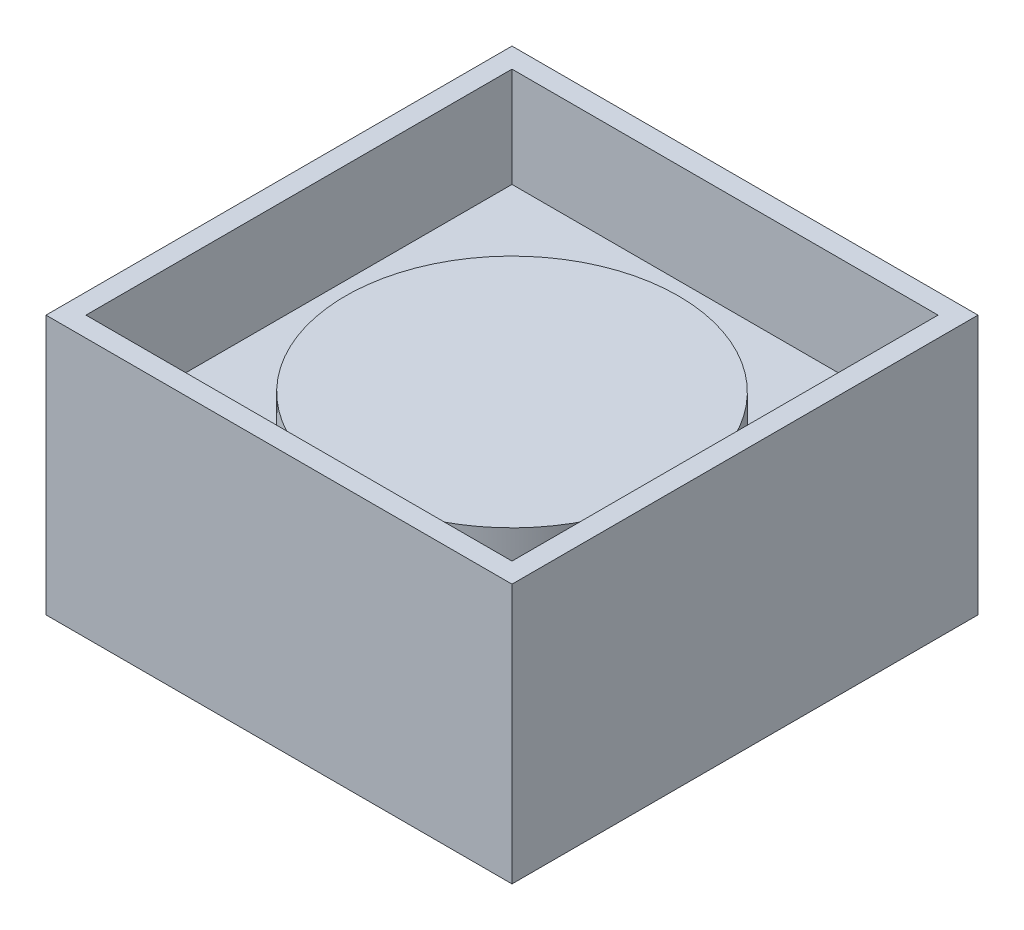
ISO-10303-21;
HEADER;
FILE_DESCRIPTION(('STEP AP214'),'2;1');
FILE_NAME('part.step','',(''),(''),'','','');
FILE_SCHEMA(('AUTOMOTIVE_DESIGN { 1 0 10303 214 1 1 1 1 }'));
ENDSEC;
DATA;
#1=APPLICATION_CONTEXT('core data for automotive mechanical design processes');
#2=APPLICATION_PROTOCOL_DEFINITION('international standard','automotive_design',2000,#1);
#3=PRODUCT_CONTEXT('',#1,'mechanical');
#4=PRODUCT('Part','Part','',(#3));
#5=PRODUCT_RELATED_PRODUCT_CATEGORY('part','',(#4));
#6=PRODUCT_DEFINITION_FORMATION('','',#4);
#7=PRODUCT_DEFINITION_CONTEXT('part definition',#1,'design');
#8=PRODUCT_DEFINITION('design','',#6,#7);
#9=PRODUCT_DEFINITION_SHAPE('','',#8);
#10=(LENGTH_UNIT() NAMED_UNIT(*) SI_UNIT(.MILLI.,.METRE.));
#11=(NAMED_UNIT(*) PLANE_ANGLE_UNIT() SI_UNIT($,.RADIAN.));
#12=(NAMED_UNIT(*) SI_UNIT($,.STERADIAN.) SOLID_ANGLE_UNIT());
#13=UNCERTAINTY_MEASURE_WITH_UNIT(LENGTH_MEASURE(1.E-05),#10,'distance_accuracy_value','');
#14=(GEOMETRIC_REPRESENTATION_CONTEXT(3) GLOBAL_UNCERTAINTY_ASSIGNED_CONTEXT((#13)) GLOBAL_UNIT_ASSIGNED_CONTEXT((#10,
#11,#12)) REPRESENTATION_CONTEXT('',''));
#15=CARTESIAN_POINT('',(0.,0.,0.));
#16=DIRECTION('',(0.,0.,1.));
#17=DIRECTION('',(1.,0.,0.));
#18=AXIS2_PLACEMENT_3D('',#15,#16,#17);
#19=CARTESIAN_POINT('',(-35.,39.,-35.));
#20=DIRECTION('',(1.,0.,0.));
#21=DIRECTION('',(0.,0.,-1.));
#22=AXIS2_PLACEMENT_3D('',#19,#20,#21);
#23=PLANE('',#22);
#24=DIRECTION('',(0.,0.,1.));
#25=VECTOR('',#24,1.);
#26=CARTESIAN_POINT('',(-35.,0.,-35.));
#27=LINE('',#26,#25);
#28=CARTESIAN_POINT('',(-35.,0.,-35.));
#29=VERTEX_POINT('',#28);
#30=CARTESIAN_POINT('',(-35.,0.,35.));
#31=VERTEX_POINT('',#30);
#32=EDGE_CURVE('E144',#29,#31,#27,.T.);
#33=ORIENTED_EDGE('',*,*,#32,.T.);
#34=DIRECTION('',(0.,-1.,0.));
#35=VECTOR('',#34,1.);
#36=CARTESIAN_POINT('',(-35.,39.,35.));
#37=LINE('',#36,#35);
#38=CARTESIAN_POINT('',(-35.,39.,35.));
#39=VERTEX_POINT('',#38);
#40=EDGE_CURVE('E40',#39,#31,#37,.T.);
#41=ORIENTED_EDGE('',*,*,#40,.F.);
#42=DIRECTION('',(0.,0.,1.));
#43=VECTOR('',#42,1.);
#44=CARTESIAN_POINT('',(-35.,39.,-35.));
#45=LINE('',#44,#43);
#46=CARTESIAN_POINT('',(-35.,39.,-35.));
#47=VERTEX_POINT('',#46);
#48=EDGE_CURVE('E148',#47,#39,#45,.T.);
#49=ORIENTED_EDGE('',*,*,#48,.F.);
#50=DIRECTION('',(0.,-1.,0.));
#51=VECTOR('',#50,1.);
#52=CARTESIAN_POINT('',(-35.,39.,-35.));
#53=LINE('',#52,#51);
#54=EDGE_CURVE('E154',#47,#29,#53,.T.);
#55=ORIENTED_EDGE('',*,*,#54,.T.);
#56=EDGE_LOOP('',(#33,#41,#49,#55));
#57=FACE_BOUND('',#56,.T.);
#58=ADVANCED_FACE('F33',(#57),#23,.F.);
#59=CARTESIAN_POINT('',(35.,39.,35.));
#60=DIRECTION('',(0.,0.,-1.));
#61=DIRECTION('',(-1.,0.,0.));
#62=AXIS2_PLACEMENT_3D('',#59,#60,#61);
#63=PLANE('',#62);
#64=DIRECTION('',(1.,0.,0.));
#65=VECTOR('',#64,1.);
#66=CARTESIAN_POINT('',(35.,0.,35.));
#67=LINE('',#66,#65);
#68=CARTESIAN_POINT('',(35.,0.,35.));
#69=VERTEX_POINT('',#68);
#70=EDGE_CURVE('E157',#31,#69,#67,.T.);
#71=ORIENTED_EDGE('',*,*,#70,.T.);
#72=DIRECTION('',(0.,-1.,0.));
#73=VECTOR('',#72,1.);
#74=CARTESIAN_POINT('',(35.,39.,35.));
#75=LINE('',#74,#73);
#76=CARTESIAN_POINT('',(35.,39.,35.));
#77=VERTEX_POINT('',#76);
#78=EDGE_CURVE('E165',#77,#69,#75,.T.);
#79=ORIENTED_EDGE('',*,*,#78,.F.);
#80=DIRECTION('',(1.,0.,0.));
#81=VECTOR('',#80,1.);
#82=CARTESIAN_POINT('',(35.,39.,35.));
#83=LINE('',#82,#81);
#84=EDGE_CURVE('E85',#39,#77,#83,.T.);
#85=ORIENTED_EDGE('',*,*,#84,.F.);
#86=ORIENTED_EDGE('',*,*,#40,.T.);
#87=EDGE_LOOP('',(#71,#79,#85,#86));
#88=FACE_BOUND('',#87,.T.);
#89=ADVANCED_FACE('F168',(#88),#63,.F.);
#90=CARTESIAN_POINT('',(35.,39.,-35.));
#91=DIRECTION('',(-1.,0.,0.));
#92=DIRECTION('',(0.,0.,1.));
#93=AXIS2_PLACEMENT_3D('',#90,#91,#92);
#94=PLANE('',#93);
#95=DIRECTION('',(0.,0.,-1.));
#96=VECTOR('',#95,1.);
#97=CARTESIAN_POINT('',(35.,0.,-35.));
#98=LINE('',#97,#96);
#99=CARTESIAN_POINT('',(35.,0.,-35.));
#100=VERTEX_POINT('',#99);
#101=EDGE_CURVE('E159',#69,#100,#98,.T.);
#102=ORIENTED_EDGE('',*,*,#101,.T.);
#103=DIRECTION('',(0.,-1.,0.));
#104=VECTOR('',#103,1.);
#105=CARTESIAN_POINT('',(35.,39.,-35.));
#106=LINE('',#105,#104);
#107=CARTESIAN_POINT('',(35.,39.,-35.));
#108=VERTEX_POINT('',#107);
#109=EDGE_CURVE('E163',#108,#100,#106,.T.);
#110=ORIENTED_EDGE('',*,*,#109,.F.);
#111=DIRECTION('',(0.,0.,-1.));
#112=VECTOR('',#111,1.);
#113=CARTESIAN_POINT('',(35.,39.,-35.));
#114=LINE('',#113,#112);
#115=EDGE_CURVE('E151',#77,#108,#114,.T.);
#116=ORIENTED_EDGE('',*,*,#115,.F.);
#117=ORIENTED_EDGE('',*,*,#78,.T.);
#118=EDGE_LOOP('',(#102,#110,#116,#117));
#119=FACE_BOUND('',#118,.T.);
#120=ADVANCED_FACE('F177',(#119),#94,.F.);
#121=CARTESIAN_POINT('',(35.,39.,-35.));
#122=DIRECTION('',(0.,0.,1.));
#123=DIRECTION('',(1.,0.,0.));
#124=AXIS2_PLACEMENT_3D('',#121,#122,#123);
#125=PLANE('',#124);
#126=DIRECTION('',(-1.,0.,0.));
#127=VECTOR('',#126,1.);
#128=CARTESIAN_POINT('',(35.,0.,-35.));
#129=LINE('',#128,#127);
#130=EDGE_CURVE('E77',#100,#29,#129,.T.);
#131=ORIENTED_EDGE('',*,*,#130,.T.);
#132=ORIENTED_EDGE('',*,*,#54,.F.);
#133=DIRECTION('',(-1.,0.,0.));
#134=VECTOR('',#133,1.);
#135=CARTESIAN_POINT('',(35.,39.,-35.));
#136=LINE('',#135,#134);
#137=EDGE_CURVE('E56',#108,#47,#136,.T.);
#138=ORIENTED_EDGE('',*,*,#137,.F.);
#139=ORIENTED_EDGE('',*,*,#109,.T.);
#140=EDGE_LOOP('',(#131,#132,#138,#139));
#141=FACE_BOUND('',#140,.T.);
#142=ADVANCED_FACE('F179',(#141),#125,.F.);
#143=CARTESIAN_POINT('',(0.,39.,0.));
#144=DIRECTION('',(0.,-1.,0.));
#145=DIRECTION('',(0.,0.,-1.));
#146=AXIS2_PLACEMENT_3D('',#143,#144,#145);
#147=PLANE('',#146);
#148=DIRECTION('',(1.,0.,0.));
#149=VECTOR('',#148,1.);
#150=CARTESIAN_POINT('',(32.,39.,32.));
#151=LINE('',#150,#149);
#152=CARTESIAN_POINT('',(-32.,39.,32.));
#153=VERTEX_POINT('',#152);
#154=CARTESIAN_POINT('',(32.,39.,32.));
#155=VERTEX_POINT('',#154);
#156=EDGE_CURVE('E138',#153,#155,#151,.T.);
#157=ORIENTED_EDGE('',*,*,#156,.F.);
#158=DIRECTION('',(0.,0.,1.));
#159=VECTOR('',#158,1.);
#160=CARTESIAN_POINT('',(-32.,39.,-32.));
#161=LINE('',#160,#159);
#162=CARTESIAN_POINT('',(-32.,39.,-32.));
#163=VERTEX_POINT('',#162);
#164=EDGE_CURVE('E47',#163,#153,#161,.T.);
#165=ORIENTED_EDGE('',*,*,#164,.F.);
#166=DIRECTION('',(-1.,0.,0.));
#167=VECTOR('',#166,1.);
#168=CARTESIAN_POINT('',(32.,39.,-32.));
#169=LINE('',#168,#167);
#170=CARTESIAN_POINT('',(32.,39.,-32.));
#171=VERTEX_POINT('',#170);
#172=EDGE_CURVE('E127',#171,#163,#169,.T.);
#173=ORIENTED_EDGE('',*,*,#172,.F.);
#174=DIRECTION('',(0.,0.,-1.));
#175=VECTOR('',#174,1.);
#176=CARTESIAN_POINT('',(32.,39.,-32.));
#177=LINE('',#176,#175);
#178=EDGE_CURVE('E130',#155,#171,#177,.T.);
#179=ORIENTED_EDGE('',*,*,#178,.F.);
#180=EDGE_LOOP('',(#157,#165,#173,#179));
#181=FACE_BOUND('',#180,.T.);
#182=ORIENTED_EDGE('',*,*,#48,.T.);
#183=ORIENTED_EDGE('',*,*,#84,.T.);
#184=ORIENTED_EDGE('',*,*,#115,.T.);
#185=ORIENTED_EDGE('',*,*,#137,.T.);
#186=EDGE_LOOP('',(#182,#183,#184,#185));
#187=FACE_BOUND('',#186,.T.);
#188=ADVANCED_FACE('F180',(#181,#187),#147,.F.);
#189=CARTESIAN_POINT('',(0.,0.,0.));
#190=DIRECTION('',(0.,-1.,0.));
#191=DIRECTION('',(0.,0.,-1.));
#192=AXIS2_PLACEMENT_3D('',#189,#190,#191);
#193=PLANE('',#192);
#194=ORIENTED_EDGE('',*,*,#32,.F.);
#195=ORIENTED_EDGE('',*,*,#130,.F.);
#196=ORIENTED_EDGE('',*,*,#101,.F.);
#197=ORIENTED_EDGE('',*,*,#70,.F.);
#198=EDGE_LOOP('',(#194,#195,#196,#197));
#199=FACE_BOUND('',#198,.T.);
#200=ADVANCED_FACE('F173',(#199),#193,.T.);
#201=CARTESIAN_POINT('',(-32.,24.,-32.));
#202=DIRECTION('',(-1.,0.,0.));
#203=DIRECTION('',(0.,0.,1.));
#204=AXIS2_PLACEMENT_3D('',#201,#202,#203);
#205=PLANE('',#204);
#206=ORIENTED_EDGE('',*,*,#164,.T.);
#207=DIRECTION('',(0.,1.,0.));
#208=VECTOR('',#207,1.);
#209=CARTESIAN_POINT('',(-32.,24.,32.));
#210=LINE('',#209,#208);
#211=CARTESIAN_POINT('',(-32.,24.,32.));
#212=VERTEX_POINT('',#211);
#213=EDGE_CURVE('E105',#212,#153,#210,.T.);
#214=ORIENTED_EDGE('',*,*,#213,.F.);
#215=DIRECTION('',(0.,0.,1.));
#216=VECTOR('',#215,1.);
#217=CARTESIAN_POINT('',(-32.,24.,-32.));
#218=LINE('',#217,#216);
#219=CARTESIAN_POINT('',(-32.,24.,-32.));
#220=VERTEX_POINT('',#219);
#221=EDGE_CURVE('E109',#220,#212,#218,.T.);
#222=ORIENTED_EDGE('',*,*,#221,.F.);
#223=DIRECTION('',(0.,1.,0.));
#224=VECTOR('',#223,1.);
#225=CARTESIAN_POINT('',(-32.,24.,-32.));
#226=LINE('',#225,#224);
#227=EDGE_CURVE('E142',#220,#163,#226,.T.);
#228=ORIENTED_EDGE('',*,*,#227,.T.);
#229=EDGE_LOOP('',(#206,#214,#222,#228));
#230=FACE_BOUND('',#229,.T.);
#231=ADVANCED_FACE('F107',(#230),#205,.F.);
#232=CARTESIAN_POINT('',(32.,24.,-32.));
#233=DIRECTION('',(0.,0.,-1.));
#234=DIRECTION('',(-1.,0.,0.));
#235=AXIS2_PLACEMENT_3D('',#232,#233,#234);
#236=PLANE('',#235);
#237=ORIENTED_EDGE('',*,*,#172,.T.);
#238=ORIENTED_EDGE('',*,*,#227,.F.);
#239=DIRECTION('',(-1.,0.,0.));
#240=VECTOR('',#239,1.);
#241=CARTESIAN_POINT('',(32.,24.,-32.));
#242=LINE('',#241,#240);
#243=CARTESIAN_POINT('',(32.,24.,-32.));
#244=VERTEX_POINT('',#243);
#245=EDGE_CURVE('E115',#244,#220,#242,.T.);
#246=ORIENTED_EDGE('',*,*,#245,.F.);
#247=DIRECTION('',(0.,1.,0.));
#248=VECTOR('',#247,1.);
#249=CARTESIAN_POINT('',(32.,24.,-32.));
#250=LINE('',#249,#248);
#251=EDGE_CURVE('E145',#244,#171,#250,.T.);
#252=ORIENTED_EDGE('',*,*,#251,.T.);
#253=EDGE_LOOP('',(#237,#238,#246,#252));
#254=FACE_BOUND('',#253,.T.);
#255=ADVANCED_FACE('F224',(#254),#236,.F.);
#256=CARTESIAN_POINT('',(32.,24.,-32.));
#257=DIRECTION('',(1.,0.,0.));
#258=DIRECTION('',(0.,0.,-1.));
#259=AXIS2_PLACEMENT_3D('',#256,#257,#258);
#260=PLANE('',#259);
#261=ORIENTED_EDGE('',*,*,#178,.T.);
#262=ORIENTED_EDGE('',*,*,#251,.F.);
#263=DIRECTION('',(0.,0.,-1.));
#264=VECTOR('',#263,1.);
#265=CARTESIAN_POINT('',(32.,24.,-32.));
#266=LINE('',#265,#264);
#267=CARTESIAN_POINT('',(32.,24.,32.));
#268=VERTEX_POINT('',#267);
#269=EDGE_CURVE('E123',#268,#244,#266,.T.);
#270=ORIENTED_EDGE('',*,*,#269,.F.);
#271=DIRECTION('',(0.,1.,0.));
#272=VECTOR('',#271,1.);
#273=CARTESIAN_POINT('',(32.,24.,32.));
#274=LINE('',#273,#272);
#275=EDGE_CURVE('E114',#268,#155,#274,.T.);
#276=ORIENTED_EDGE('',*,*,#275,.T.);
#277=EDGE_LOOP('',(#261,#262,#270,#276));
#278=FACE_BOUND('',#277,.T.);
#279=ADVANCED_FACE('F232',(#278),#260,.F.);
#280=CARTESIAN_POINT('',(32.,24.,32.));
#281=DIRECTION('',(0.,0.,1.));
#282=DIRECTION('',(1.,0.,0.));
#283=AXIS2_PLACEMENT_3D('',#280,#281,#282);
#284=PLANE('',#283);
#285=ORIENTED_EDGE('',*,*,#156,.T.);
#286=ORIENTED_EDGE('',*,*,#275,.F.);
#287=DIRECTION('',(1.,0.,0.));
#288=VECTOR('',#287,1.);
#289=CARTESIAN_POINT('',(32.,24.,32.));
#290=LINE('',#289,#288);
#291=EDGE_CURVE('E118',#212,#268,#290,.T.);
#292=ORIENTED_EDGE('',*,*,#291,.F.);
#293=ORIENTED_EDGE('',*,*,#213,.T.);
#294=EDGE_LOOP('',(#285,#286,#292,#293));
#295=FACE_BOUND('',#294,.T.);
#296=ADVANCED_FACE('F119',(#295),#284,.F.);
#297=CARTESIAN_POINT('',(0.,24.,0.));
#298=DIRECTION('',(0.,-1.,0.));
#299=DIRECTION('',(0.,0.,-1.));
#300=AXIS2_PLACEMENT_3D('',#297,#298,#299);
#301=PLANE('',#300);
#302=CARTESIAN_POINT('',(0.,24.,0.));
#303=DIRECTION('',(0.,-1.,0.));
#304=DIRECTION('',(0.,0.,-1.));
#305=AXIS2_PLACEMENT_3D('',#302,#303,#304);
#306=CIRCLE('',#305,25.);
#307=CARTESIAN_POINT('',(0.,24.,-25.));
#308=VERTEX_POINT('',#307);
#309=EDGE_CURVE('E11',#308,#308,#306,.F.);
#310=ORIENTED_EDGE('',*,*,#309,.F.);
#311=EDGE_LOOP('',(#310));
#312=FACE_BOUND('',#311,.T.);
#313=ORIENTED_EDGE('',*,*,#221,.T.);
#314=ORIENTED_EDGE('',*,*,#291,.T.);
#315=ORIENTED_EDGE('',*,*,#269,.T.);
#316=ORIENTED_EDGE('',*,*,#245,.T.);
#317=EDGE_LOOP('',(#313,#314,#315,#316));
#318=FACE_BOUND('',#317,.T.);
#319=ADVANCED_FACE('F125',(#312,#318),#301,.F.);
#320=CARTESIAN_POINT('',(0.,29.,0.));
#321=DIRECTION('',(0.,-1.,0.));
#322=DIRECTION('',(0.,0.,-1.));
#323=AXIS2_PLACEMENT_3D('',#320,#321,#322);
#324=CYLINDRICAL_SURFACE('',#323,25.);
#325=CARTESIAN_POINT('',(0.,29.,0.));
#326=DIRECTION('',(0.,1.,0.));
#327=DIRECTION('',(0.,0.,1.));
#328=AXIS2_PLACEMENT_3D('',#325,#326,#327);
#329=CIRCLE('',#328,25.);
#330=CARTESIAN_POINT('',(0.,29.,25.));
#331=VERTEX_POINT('',#330);
#332=EDGE_CURVE('E133',#331,#331,#329,.T.);
#333=ORIENTED_EDGE('',*,*,#332,.F.);
#334=EDGE_LOOP('',(#333));
#335=FACE_BOUND('',#334,.T.);
#336=ORIENTED_EDGE('',*,*,#309,.T.);
#337=EDGE_LOOP('',(#336));
#338=FACE_BOUND('',#337,.T.);
#339=ADVANCED_FACE('F259',(#335,#338),#324,.T.);
#340=CARTESIAN_POINT('',(0.,29.,0.));
#341=DIRECTION('',(0.,1.,0.));
#342=DIRECTION('',(0.,0.,1.));
#343=AXIS2_PLACEMENT_3D('',#340,#341,#342);
#344=PLANE('',#343);
#345=ORIENTED_EDGE('',*,*,#332,.T.);
#346=EDGE_LOOP('',(#345));
#347=FACE_BOUND('',#346,.T.);
#348=ADVANCED_FACE('F269',(#347),#344,.T.);
#349=CLOSED_SHELL('',(#58,#89,#120,#142,#188,#200,#231,#255,#279,#296,#319,#339,#348));
#350=MANIFOLD_SOLID_BREP('B2',#349);
#351=ADVANCED_BREP_SHAPE_REPRESENTATION('',(#18,#350),#14);
#352=SHAPE_DEFINITION_REPRESENTATION(#9,#351);
ENDSEC;
END-ISO-10303-21;
